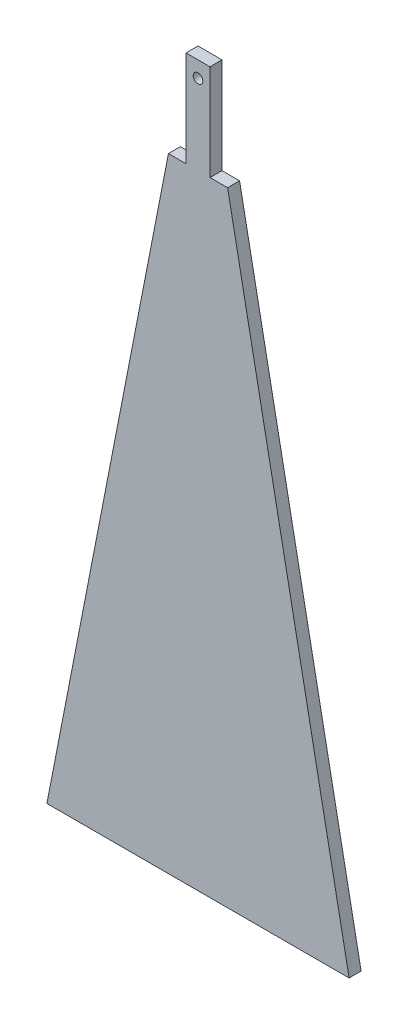
ISO-10303-21;
HEADER;
FILE_DESCRIPTION(('STEP AP214'),'2;1');
FILE_NAME('part.step','',(''),(''),'','','');
FILE_SCHEMA(('AUTOMOTIVE_DESIGN { 1 0 10303 214 1 1 1 1 }'));
ENDSEC;
DATA;
#1=APPLICATION_CONTEXT('core data for automotive mechanical design processes');
#2=APPLICATION_PROTOCOL_DEFINITION('international standard','automotive_design',2000,#1);
#3=PRODUCT_CONTEXT('',#1,'mechanical');
#4=PRODUCT('Part','Part','',(#3));
#5=PRODUCT_RELATED_PRODUCT_CATEGORY('part','',(#4));
#6=PRODUCT_DEFINITION_FORMATION('','',#4);
#7=PRODUCT_DEFINITION_CONTEXT('part definition',#1,'design');
#8=PRODUCT_DEFINITION('design','',#6,#7);
#9=PRODUCT_DEFINITION_SHAPE('','',#8);
#10=(LENGTH_UNIT() NAMED_UNIT(*) SI_UNIT(.MILLI.,.METRE.));
#11=(NAMED_UNIT(*) PLANE_ANGLE_UNIT() SI_UNIT($,.RADIAN.));
#12=(NAMED_UNIT(*) SI_UNIT($,.STERADIAN.) SOLID_ANGLE_UNIT());
#13=UNCERTAINTY_MEASURE_WITH_UNIT(LENGTH_MEASURE(1.E-05),#10,'distance_accuracy_value','');
#14=(GEOMETRIC_REPRESENTATION_CONTEXT(3) GLOBAL_UNCERTAINTY_ASSIGNED_CONTEXT((#13)) GLOBAL_UNIT_ASSIGNED_CONTEXT((#10,
#11,#12)) REPRESENTATION_CONTEXT('',''));
#15=CARTESIAN_POINT('',(0.,0.,0.));
#16=DIRECTION('',(0.,0.,1.));
#17=DIRECTION('',(1.,0.,0.));
#18=AXIS2_PLACEMENT_3D('',#15,#16,#17);
#19=CARTESIAN_POINT('',(-2.5,150.,-2.5));
#20=DIRECTION('',(-1.,0.,0.));
#21=DIRECTION('',(0.,-1.,0.));
#22=AXIS2_PLACEMENT_3D('',#19,#20,#21);
#23=PLANE('',#22);
#24=DIRECTION('',(0.,-1.,0.));
#25=VECTOR('',#24,1.);
#26=CARTESIAN_POINT('',(-2.5,150.,0.));
#27=LINE('',#26,#25);
#28=CARTESIAN_POINT('',(-2.5,150.,0.));
#29=VERTEX_POINT('',#28);
#30=CARTESIAN_POINT('',(-2.5,130.,0.));
#31=VERTEX_POINT('',#30);
#32=EDGE_CURVE('E134',#29,#31,#27,.T.);
#33=ORIENTED_EDGE('',*,*,#32,.F.);
#34=DIRECTION('',(0.,0.,1.));
#35=VECTOR('',#34,1.);
#36=CARTESIAN_POINT('',(-2.5,150.,-2.5));
#37=LINE('',#36,#35);
#38=CARTESIAN_POINT('',(-2.5,150.,-2.5));
#39=VERTEX_POINT('',#38);
#40=EDGE_CURVE('E11',#39,#29,#37,.T.);
#41=ORIENTED_EDGE('',*,*,#40,.F.);
#42=DIRECTION('',(0.,-1.,0.));
#43=VECTOR('',#42,1.);
#44=CARTESIAN_POINT('',(-2.5,150.,-2.5));
#45=LINE('',#44,#43);
#46=CARTESIAN_POINT('',(-2.5,130.,-2.5));
#47=VERTEX_POINT('',#46);
#48=EDGE_CURVE('E155',#39,#47,#45,.T.);
#49=ORIENTED_EDGE('',*,*,#48,.T.);
#50=DIRECTION('',(0.,0.,1.));
#51=VECTOR('',#50,1.);
#52=CARTESIAN_POINT('',(-2.5,130.,-2.5));
#53=LINE('',#52,#51);
#54=EDGE_CURVE('E40',#47,#31,#53,.T.);
#55=ORIENTED_EDGE('',*,*,#54,.T.);
#56=EDGE_LOOP('',(#33,#41,#49,#55));
#57=FACE_BOUND('',#56,.T.);
#58=ADVANCED_FACE('F37',(#57),#23,.T.);
#59=CARTESIAN_POINT('',(2.5,150.,-2.5));
#60=DIRECTION('',(0.,1.,0.));
#61=DIRECTION('',(0.,0.,1.));
#62=AXIS2_PLACEMENT_3D('',#59,#60,#61);
#63=PLANE('',#62);
#64=DIRECTION('',(-1.,0.,0.));
#65=VECTOR('',#64,1.);
#66=CARTESIAN_POINT('',(2.5,150.,0.));
#67=LINE('',#66,#65);
#68=CARTESIAN_POINT('',(2.5,150.,0.));
#69=VERTEX_POINT('',#68);
#70=EDGE_CURVE('E153',#69,#29,#67,.T.);
#71=ORIENTED_EDGE('',*,*,#70,.F.);
#72=DIRECTION('',(0.,0.,1.));
#73=VECTOR('',#72,1.);
#74=CARTESIAN_POINT('',(2.5,150.,-2.5));
#75=LINE('',#74,#73);
#76=CARTESIAN_POINT('',(2.5,150.,-2.5));
#77=VERTEX_POINT('',#76);
#78=EDGE_CURVE('E46',#77,#69,#75,.T.);
#79=ORIENTED_EDGE('',*,*,#78,.F.);
#80=DIRECTION('',(-1.,0.,0.));
#81=VECTOR('',#80,1.);
#82=CARTESIAN_POINT('',(2.5,150.,-2.5));
#83=LINE('',#82,#81);
#84=EDGE_CURVE('E124',#77,#39,#83,.T.);
#85=ORIENTED_EDGE('',*,*,#84,.T.);
#86=ORIENTED_EDGE('',*,*,#40,.T.);
#87=EDGE_LOOP('',(#71,#79,#85,#86));
#88=FACE_BOUND('',#87,.T.);
#89=ADVANCED_FACE('F167',(#88),#63,.T.);
#90=CARTESIAN_POINT('',(2.5,130.,-2.5));
#91=DIRECTION('',(1.,0.,0.));
#92=DIRECTION('',(0.,1.,0.));
#93=AXIS2_PLACEMENT_3D('',#90,#91,#92);
#94=PLANE('',#93);
#95=DIRECTION('',(0.,1.,0.));
#96=VECTOR('',#95,1.);
#97=CARTESIAN_POINT('',(2.5,130.,0.));
#98=LINE('',#97,#96);
#99=CARTESIAN_POINT('',(2.5,130.,0.));
#100=VERTEX_POINT('',#99);
#101=EDGE_CURVE('E111',#100,#69,#98,.T.);
#102=ORIENTED_EDGE('',*,*,#101,.F.);
#103=DIRECTION('',(0.,0.,1.));
#104=VECTOR('',#103,1.);
#105=CARTESIAN_POINT('',(2.5,130.,-2.5));
#106=LINE('',#105,#104);
#107=CARTESIAN_POINT('',(2.5,130.,-2.5));
#108=VERTEX_POINT('',#107);
#109=EDGE_CURVE('E106',#108,#100,#106,.T.);
#110=ORIENTED_EDGE('',*,*,#109,.F.);
#111=DIRECTION('',(0.,1.,0.));
#112=VECTOR('',#111,1.);
#113=CARTESIAN_POINT('',(2.5,130.,-2.5));
#114=LINE('',#113,#112);
#115=EDGE_CURVE('E109',#108,#77,#114,.T.);
#116=ORIENTED_EDGE('',*,*,#115,.T.);
#117=ORIENTED_EDGE('',*,*,#78,.T.);
#118=EDGE_LOOP('',(#102,#110,#116,#117));
#119=FACE_BOUND('',#118,.T.);
#120=ADVANCED_FACE('F108',(#119),#94,.T.);
#121=CARTESIAN_POINT('',(6.1691127772994,130.,-2.5));
#122=DIRECTION('',(0.,1.,0.));
#123=DIRECTION('',(0.,0.,1.));
#124=AXIS2_PLACEMENT_3D('',#121,#122,#123);
#125=PLANE('',#124);
#126=DIRECTION('',(-1.,0.,0.));
#127=VECTOR('',#126,1.);
#128=CARTESIAN_POINT('',(6.1691127772994,130.,0.));
#129=LINE('',#128,#127);
#130=CARTESIAN_POINT('',(6.1691127772994,130.,0.));
#131=VERTEX_POINT('',#130);
#132=EDGE_CURVE('E150',#131,#100,#129,.T.);
#133=ORIENTED_EDGE('',*,*,#132,.F.);
#134=DIRECTION('',(0.,0.,1.));
#135=VECTOR('',#134,1.);
#136=CARTESIAN_POINT('',(6.1691127772994,130.,-2.5));
#137=LINE('',#136,#135);
#138=CARTESIAN_POINT('',(6.1691127772994,130.,-2.5));
#139=VERTEX_POINT('',#138);
#140=EDGE_CURVE('E116',#139,#131,#137,.T.);
#141=ORIENTED_EDGE('',*,*,#140,.F.);
#142=DIRECTION('',(-1.,0.,0.));
#143=VECTOR('',#142,1.);
#144=CARTESIAN_POINT('',(6.1691127772994,130.,-2.5));
#145=LINE('',#144,#143);
#146=EDGE_CURVE('E122',#139,#108,#145,.T.);
#147=ORIENTED_EDGE('',*,*,#146,.T.);
#148=ORIENTED_EDGE('',*,*,#109,.T.);
#149=EDGE_LOOP('',(#133,#141,#147,#148));
#150=FACE_BOUND('',#149,.T.);
#151=ADVANCED_FACE('F126',(#150),#125,.T.);
#152=CARTESIAN_POINT('',(31.5,0.,-2.5));
#153=DIRECTION('',(0.981540183388658,0.191256028384361,0.));
#154=DIRECTION('',(-0.191256028384361,0.981540183388658,0.));
#155=AXIS2_PLACEMENT_3D('',#152,#153,#154);
#156=PLANE('',#155);
#157=DIRECTION('',(-0.191256028384361,0.981540183388658,0.));
#158=VECTOR('',#157,1.);
#159=CARTESIAN_POINT('',(31.5,0.,0.));
#160=LINE('',#159,#158);
#161=CARTESIAN_POINT('',(31.5,0.,0.));
#162=VERTEX_POINT('',#161);
#163=EDGE_CURVE('E147',#162,#131,#160,.T.);
#164=ORIENTED_EDGE('',*,*,#163,.F.);
#165=DIRECTION('',(0.,0.,1.));
#166=VECTOR('',#165,1.);
#167=CARTESIAN_POINT('',(31.5,0.,-2.5));
#168=LINE('',#167,#166);
#169=CARTESIAN_POINT('',(31.5,0.,-2.5));
#170=VERTEX_POINT('',#169);
#171=EDGE_CURVE('E159',#170,#162,#168,.T.);
#172=ORIENTED_EDGE('',*,*,#171,.F.);
#173=DIRECTION('',(-0.191256028384361,0.981540183388658,0.));
#174=VECTOR('',#173,1.);
#175=CARTESIAN_POINT('',(31.5,0.,-2.5));
#176=LINE('',#175,#174);
#177=EDGE_CURVE('E127',#170,#139,#176,.T.);
#178=ORIENTED_EDGE('',*,*,#177,.T.);
#179=ORIENTED_EDGE('',*,*,#140,.T.);
#180=EDGE_LOOP('',(#164,#172,#178,#179));
#181=FACE_BOUND('',#180,.T.);
#182=ADVANCED_FACE('F180',(#181),#156,.T.);
#183=CARTESIAN_POINT('',(-31.5,0.,-2.5));
#184=DIRECTION('',(0.,-1.,0.));
#185=DIRECTION('',(0.,0.,-1.));
#186=AXIS2_PLACEMENT_3D('',#183,#184,#185);
#187=PLANE('',#186);
#188=DIRECTION('',(1.,0.,0.));
#189=VECTOR('',#188,1.);
#190=CARTESIAN_POINT('',(-31.5,0.,0.));
#191=LINE('',#190,#189);
#192=CARTESIAN_POINT('',(-31.5,0.,0.));
#193=VERTEX_POINT('',#192);
#194=EDGE_CURVE('E144',#193,#162,#191,.T.);
#195=ORIENTED_EDGE('',*,*,#194,.F.);
#196=DIRECTION('',(0.,0.,1.));
#197=VECTOR('',#196,1.);
#198=CARTESIAN_POINT('',(-31.5,0.,-2.5));
#199=LINE('',#198,#197);
#200=CARTESIAN_POINT('',(-31.5,0.,-2.5));
#201=VERTEX_POINT('',#200);
#202=EDGE_CURVE('E161',#201,#193,#199,.T.);
#203=ORIENTED_EDGE('',*,*,#202,.F.);
#204=DIRECTION('',(1.,0.,0.));
#205=VECTOR('',#204,1.);
#206=CARTESIAN_POINT('',(-31.5,0.,-2.5));
#207=LINE('',#206,#205);
#208=EDGE_CURVE('E129',#201,#170,#207,.T.);
#209=ORIENTED_EDGE('',*,*,#208,.T.);
#210=ORIENTED_EDGE('',*,*,#171,.T.);
#211=EDGE_LOOP('',(#195,#203,#209,#210));
#212=FACE_BOUND('',#211,.T.);
#213=ADVANCED_FACE('F183',(#212),#187,.T.);
#214=CARTESIAN_POINT('',(-6.1691127772994,130.,-2.5));
#215=DIRECTION('',(-0.981540183388658,0.191256028384361,0.));
#216=DIRECTION('',(-0.191256028384361,-0.981540183388658,0.));
#217=AXIS2_PLACEMENT_3D('',#214,#215,#216);
#218=PLANE('',#217);
#219=DIRECTION('',(-0.191256028384361,-0.981540183388658,0.));
#220=VECTOR('',#219,1.);
#221=CARTESIAN_POINT('',(-6.1691127772994,130.,0.));
#222=LINE('',#221,#220);
#223=CARTESIAN_POINT('',(-6.1691127772994,130.,0.));
#224=VERTEX_POINT('',#223);
#225=EDGE_CURVE('E141',#224,#193,#222,.T.);
#226=ORIENTED_EDGE('',*,*,#225,.F.);
#227=DIRECTION('',(0.,0.,1.));
#228=VECTOR('',#227,1.);
#229=CARTESIAN_POINT('',(-6.1691127772994,130.,-2.5));
#230=LINE('',#229,#228);
#231=CARTESIAN_POINT('',(-6.1691127772994,130.,-2.5));
#232=VERTEX_POINT('',#231);
#233=EDGE_CURVE('E162',#232,#224,#230,.T.);
#234=ORIENTED_EDGE('',*,*,#233,.F.);
#235=DIRECTION('',(-0.191256028384361,-0.981540183388658,0.));
#236=VECTOR('',#235,1.);
#237=CARTESIAN_POINT('',(-6.1691127772994,130.,-2.5));
#238=LINE('',#237,#236);
#239=EDGE_CURVE('E218',#232,#201,#238,.T.);
#240=ORIENTED_EDGE('',*,*,#239,.T.);
#241=ORIENTED_EDGE('',*,*,#202,.T.);
#242=EDGE_LOOP('',(#226,#234,#240,#241));
#243=FACE_BOUND('',#242,.T.);
#244=ADVANCED_FACE('F187',(#243),#218,.T.);
#245=CARTESIAN_POINT('',(-2.5,130.,-2.5));
#246=DIRECTION('',(0.,1.,0.));
#247=DIRECTION('',(0.,0.,1.));
#248=AXIS2_PLACEMENT_3D('',#245,#246,#247);
#249=PLANE('',#248);
#250=DIRECTION('',(-1.,0.,0.));
#251=VECTOR('',#250,1.);
#252=CARTESIAN_POINT('',(-2.5,130.,0.));
#253=LINE('',#252,#251);
#254=EDGE_CURVE('E137',#31,#224,#253,.T.);
#255=ORIENTED_EDGE('',*,*,#254,.F.);
#256=ORIENTED_EDGE('',*,*,#54,.F.);
#257=DIRECTION('',(-1.,0.,0.));
#258=VECTOR('',#257,1.);
#259=CARTESIAN_POINT('',(-2.5,130.,-2.5));
#260=LINE('',#259,#258);
#261=EDGE_CURVE('E216',#47,#232,#260,.T.);
#262=ORIENTED_EDGE('',*,*,#261,.T.);
#263=ORIENTED_EDGE('',*,*,#233,.T.);
#264=EDGE_LOOP('',(#255,#256,#262,#263));
#265=FACE_BOUND('',#264,.T.);
#266=ADVANCED_FACE('F164',(#265),#249,.T.);
#267=CARTESIAN_POINT('',(0.,0.,-2.5));
#268=DIRECTION('',(0.,0.,-1.));
#269=DIRECTION('',(-1.,0.,0.));
#270=AXIS2_PLACEMENT_3D('',#267,#268,#269);
#271=PLANE('',#270);
#272=CARTESIAN_POINT('',(0.,146.66182548481,-2.5));
#273=DIRECTION('',(0.,0.,1.));
#274=DIRECTION('',(1.,0.,0.));
#275=AXIS2_PLACEMENT_3D('',#272,#273,#274);
#276=CIRCLE('',#275,1.);
#277=CARTESIAN_POINT('',(1.,146.66182548481,-2.5));
#278=VERTEX_POINT('',#277);
#279=EDGE_CURVE('E138',#278,#278,#276,.T.);
#280=ORIENTED_EDGE('',*,*,#279,.T.);
#281=EDGE_LOOP('',(#280));
#282=FACE_BOUND('',#281,.T.);
#283=ORIENTED_EDGE('',*,*,#48,.F.);
#284=ORIENTED_EDGE('',*,*,#84,.F.);
#285=ORIENTED_EDGE('',*,*,#115,.F.);
#286=ORIENTED_EDGE('',*,*,#146,.F.);
#287=ORIENTED_EDGE('',*,*,#177,.F.);
#288=ORIENTED_EDGE('',*,*,#208,.F.);
#289=ORIENTED_EDGE('',*,*,#239,.F.);
#290=ORIENTED_EDGE('',*,*,#261,.F.);
#291=EDGE_LOOP('',(#283,#284,#285,#286,#287,#288,#289,#290));
#292=FACE_BOUND('',#291,.T.);
#293=ADVANCED_FACE('F120',(#282,#292),#271,.T.);
#294=CARTESIAN_POINT('',(0.,0.,0.));
#295=DIRECTION('',(0.,0.,-1.));
#296=DIRECTION('',(-1.,0.,0.));
#297=AXIS2_PLACEMENT_3D('',#294,#295,#296);
#298=PLANE('',#297);
#299=CARTESIAN_POINT('',(0.,146.66182548481,0.));
#300=DIRECTION('',(0.,0.,1.));
#301=DIRECTION('',(1.,0.,0.));
#302=AXIS2_PLACEMENT_3D('',#299,#300,#301);
#303=CIRCLE('',#302,1.);
#304=CARTESIAN_POINT('',(1.,146.66182548481,0.));
#305=VERTEX_POINT('',#304);
#306=EDGE_CURVE('E211',#305,#305,#303,.T.);
#307=ORIENTED_EDGE('',*,*,#306,.F.);
#308=EDGE_LOOP('',(#307));
#309=FACE_BOUND('',#308,.T.);
#310=ORIENTED_EDGE('',*,*,#32,.T.);
#311=ORIENTED_EDGE('',*,*,#254,.T.);
#312=ORIENTED_EDGE('',*,*,#225,.T.);
#313=ORIENTED_EDGE('',*,*,#194,.T.);
#314=ORIENTED_EDGE('',*,*,#163,.T.);
#315=ORIENTED_EDGE('',*,*,#132,.T.);
#316=ORIENTED_EDGE('',*,*,#101,.T.);
#317=ORIENTED_EDGE('',*,*,#70,.T.);
#318=EDGE_LOOP('',(#310,#311,#312,#313,#314,#315,#316,#317));
#319=FACE_BOUND('',#318,.T.);
#320=ADVANCED_FACE('F166',(#309,#319),#298,.F.);
#321=CARTESIAN_POINT('',(0.,146.66182548481,-2.5));
#322=DIRECTION('',(0.,0.,1.));
#323=DIRECTION('',(1.,0.,0.));
#324=AXIS2_PLACEMENT_3D('',#321,#322,#323);
#325=CYLINDRICAL_SURFACE('',#324,1.);
#326=ORIENTED_EDGE('',*,*,#279,.F.);
#327=EDGE_LOOP('',(#326));
#328=FACE_BOUND('',#327,.T.);
#329=ORIENTED_EDGE('',*,*,#306,.T.);
#330=EDGE_LOOP('',(#329));
#331=FACE_BOUND('',#330,.T.);
#332=ADVANCED_FACE('F199',(#328,#331),#325,.F.);
#333=CLOSED_SHELL('',(#58,#89,#120,#151,#182,#213,#244,#266,#293,#320,#332));
#334=MANIFOLD_SOLID_BREP('B2',#333);
#335=ADVANCED_BREP_SHAPE_REPRESENTATION('',(#18,#334),#14);
#336=SHAPE_DEFINITION_REPRESENTATION(#9,#335);
ENDSEC;
END-ISO-10303-21;
